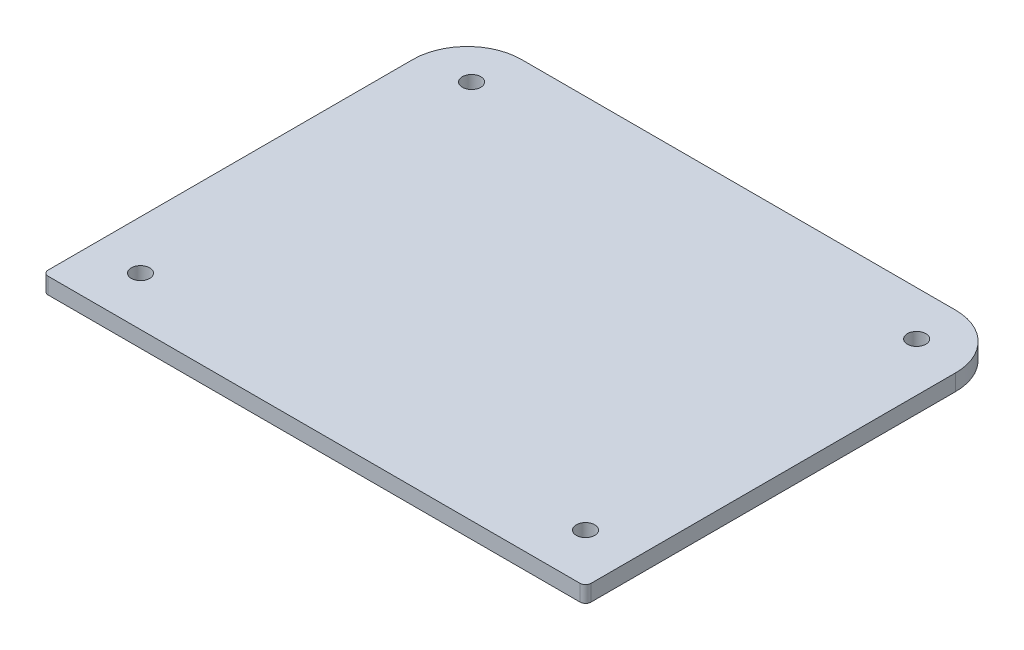
ISO-10303-21;
HEADER;
FILE_DESCRIPTION(('STEP AP214'),'2;1');
FILE_NAME('part.step','',(''),(''),'','','');
FILE_SCHEMA(('AUTOMOTIVE_DESIGN { 1 0 10303 214 1 1 1 1 }'));
ENDSEC;
DATA;
#1=APPLICATION_CONTEXT('core data for automotive mechanical design processes');
#2=APPLICATION_PROTOCOL_DEFINITION('international standard','automotive_design',2000,#1);
#3=PRODUCT_CONTEXT('',#1,'mechanical');
#4=PRODUCT('Part','Part','',(#3));
#5=PRODUCT_RELATED_PRODUCT_CATEGORY('part','',(#4));
#6=PRODUCT_DEFINITION_FORMATION('','',#4);
#7=PRODUCT_DEFINITION_CONTEXT('part definition',#1,'design');
#8=PRODUCT_DEFINITION('design','',#6,#7);
#9=PRODUCT_DEFINITION_SHAPE('','',#8);
#10=(LENGTH_UNIT() NAMED_UNIT(*) SI_UNIT(.MILLI.,.METRE.));
#11=(NAMED_UNIT(*) PLANE_ANGLE_UNIT() SI_UNIT($,.RADIAN.));
#12=(NAMED_UNIT(*) SI_UNIT($,.STERADIAN.) SOLID_ANGLE_UNIT());
#13=UNCERTAINTY_MEASURE_WITH_UNIT(LENGTH_MEASURE(1.E-05),#10,'distance_accuracy_value','');
#14=(GEOMETRIC_REPRESENTATION_CONTEXT(3) GLOBAL_UNCERTAINTY_ASSIGNED_CONTEXT((#13)) GLOBAL_UNIT_ASSIGNED_CONTEXT((#10,
#11,#12)) REPRESENTATION_CONTEXT('',''));
#15=CARTESIAN_POINT('',(0.,0.,0.));
#16=DIRECTION('',(0.,0.,1.));
#17=DIRECTION('',(1.,0.,0.));
#18=AXIS2_PLACEMENT_3D('',#15,#16,#17);
#19=CARTESIAN_POINT('',(-50.,36.,-50.));
#20=DIRECTION('',(1.,0.,0.));
#21=DIRECTION('',(0.,0.,-1.));
#22=AXIS2_PLACEMENT_3D('',#19,#20,#21);
#23=PLANE('',#22);
#24=DIRECTION('',(0.,0.,1.));
#25=VECTOR('',#24,1.);
#26=CARTESIAN_POINT('',(-50.,33.,-50.));
#27=LINE('',#26,#25);
#28=CARTESIAN_POINT('',(-50.,33.,-18.1910757686583));
#29=VERTEX_POINT('',#28);
#30=CARTESIAN_POINT('',(-50.,33.,49.));
#31=VERTEX_POINT('',#30);
#32=EDGE_CURVE('E120',#29,#31,#27,.T.);
#33=ORIENTED_EDGE('',*,*,#32,.T.);
#34=DIRECTION('',(0.,-1.,0.));
#35=VECTOR('',#34,1.);
#36=CARTESIAN_POINT('',(-50.,36.,49.));
#37=LINE('',#36,#35);
#38=CARTESIAN_POINT('',(-50.,36.,49.));
#39=VERTEX_POINT('',#38);
#40=EDGE_CURVE('E70',#31,#39,#37,.F.);
#41=ORIENTED_EDGE('',*,*,#40,.T.);
#42=DIRECTION('',(0.,0.,1.));
#43=VECTOR('',#42,1.);
#44=CARTESIAN_POINT('',(-50.,36.,-50.));
#45=LINE('',#44,#43);
#46=CARTESIAN_POINT('',(-50.,36.,-18.1910757686583));
#47=VERTEX_POINT('',#46);
#48=EDGE_CURVE('E150',#47,#39,#45,.T.);
#49=ORIENTED_EDGE('',*,*,#48,.F.);
#50=DIRECTION('',(0.,1.,0.));
#51=VECTOR('',#50,1.);
#52=CARTESIAN_POINT('',(-50.,36.,-18.1910757686583));
#53=LINE('',#52,#51);
#54=EDGE_CURVE('E134',#47,#29,#53,.F.);
#55=ORIENTED_EDGE('',*,*,#54,.T.);
#56=EDGE_LOOP('',(#33,#41,#49,#55));
#57=FACE_BOUND('',#56,.T.);
#58=ADVANCED_FACE('F43',(#57),#23,.F.);
#59=CARTESIAN_POINT('',(0.,33.,0.));
#60=DIRECTION('',(0.,1.,0.));
#61=DIRECTION('',(0.,0.,1.));
#62=AXIS2_PLACEMENT_3D('',#59,#60,#61);
#63=PLANE('',#62);
#64=CARTESIAN_POINT('',(-41.,33.,-20.));
#65=DIRECTION('',(0.,1.,0.));
#66=DIRECTION('',(0.,0.,1.));
#67=AXIS2_PLACEMENT_3D('',#64,#65,#66);
#68=CIRCLE('',#67,1.7);
#69=CARTESIAN_POINT('',(-41.,33.,-18.3));
#70=VERTEX_POINT('',#69);
#71=EDGE_CURVE('E123',#70,#70,#68,.F.);
#72=ORIENTED_EDGE('',*,*,#71,.F.);
#73=EDGE_LOOP('',(#72));
#74=FACE_BOUND('',#73,.T.);
#75=CARTESIAN_POINT('',(41.,33.,-20.));
#76=DIRECTION('',(0.,1.,0.));
#77=DIRECTION('',(0.,0.,1.));
#78=AXIS2_PLACEMENT_3D('',#75,#76,#77);
#79=CIRCLE('',#78,1.7);
#80=CARTESIAN_POINT('',(41.,33.,-18.3));
#81=VERTEX_POINT('',#80);
#82=EDGE_CURVE('E229',#81,#81,#79,.F.);
#83=ORIENTED_EDGE('',*,*,#82,.F.);
#84=EDGE_LOOP('',(#83));
#85=FACE_BOUND('',#84,.T.);
#86=CARTESIAN_POINT('',(41.,33.,41.));
#87=DIRECTION('',(0.,1.,0.));
#88=DIRECTION('',(0.,0.,1.));
#89=AXIS2_PLACEMENT_3D('',#86,#87,#88);
#90=CIRCLE('',#89,1.7);
#91=CARTESIAN_POINT('',(41.,33.,42.7));
#92=VERTEX_POINT('',#91);
#93=EDGE_CURVE('E218',#92,#92,#90,.F.);
#94=ORIENTED_EDGE('',*,*,#93,.F.);
#95=EDGE_LOOP('',(#94));
#96=FACE_BOUND('',#95,.T.);
#97=CARTESIAN_POINT('',(-41.,33.,41.));
#98=DIRECTION('',(0.,1.,0.));
#99=DIRECTION('',(0.,0.,1.));
#100=AXIS2_PLACEMENT_3D('',#97,#98,#99);
#101=CIRCLE('',#100,1.7);
#102=CARTESIAN_POINT('',(-41.,33.,42.7));
#103=VERTEX_POINT('',#102);
#104=EDGE_CURVE('E219',#103,#103,#101,.F.);
#105=ORIENTED_EDGE('',*,*,#104,.F.);
#106=EDGE_LOOP('',(#105));
#107=FACE_BOUND('',#106,.T.);
#108=DIRECTION('',(1.,0.,0.));
#109=VECTOR('',#108,1.);
#110=CARTESIAN_POINT('',(-50.,33.,50.));
#111=LINE('',#110,#109);
#112=CARTESIAN_POINT('',(-49.,33.,50.));
#113=VERTEX_POINT('',#112);
#114=CARTESIAN_POINT('',(49.,33.,50.));
#115=VERTEX_POINT('',#114);
#116=EDGE_CURVE('E147',#113,#115,#111,.T.);
#117=ORIENTED_EDGE('',*,*,#116,.F.);
#118=CARTESIAN_POINT('',(-49.,33.,49.));
#119=DIRECTION('',(0.,1.,0.));
#120=DIRECTION('',(0.,0.,1.));
#121=AXIS2_PLACEMENT_3D('',#118,#119,#120);
#122=CIRCLE('',#121,1.);
#123=EDGE_CURVE('E178',#113,#31,#122,.F.);
#124=ORIENTED_EDGE('',*,*,#123,.T.);
#125=ORIENTED_EDGE('',*,*,#32,.F.);
#126=CARTESIAN_POINT('',(-40.,33.,-18.1910757686583));
#127=DIRECTION('',(0.,1.,0.));
#128=DIRECTION('',(0.,0.,1.));
#129=AXIS2_PLACEMENT_3D('',#126,#127,#128);
#130=CIRCLE('',#129,10.);
#131=CARTESIAN_POINT('',(-40.,33.,-28.1910757686583));
#132=VERTEX_POINT('',#131);
#133=EDGE_CURVE('E133',#29,#132,#130,.F.);
#134=ORIENTED_EDGE('',*,*,#133,.T.);
#135=DIRECTION('',(-1.,0.,0.));
#136=VECTOR('',#135,1.);
#137=CARTESIAN_POINT('',(-50.,33.,-28.1910757686583));
#138=LINE('',#137,#136);
#139=CARTESIAN_POINT('',(40.,33.,-28.1910757686583));
#140=VERTEX_POINT('',#139);
#141=EDGE_CURVE('E129',#140,#132,#138,.T.);
#142=ORIENTED_EDGE('',*,*,#141,.F.);
#143=CARTESIAN_POINT('',(40.,33.,-18.1910757686583));
#144=DIRECTION('',(0.,1.,0.));
#145=DIRECTION('',(0.,0.,1.));
#146=AXIS2_PLACEMENT_3D('',#143,#144,#145);
#147=CIRCLE('',#146,10.);
#148=CARTESIAN_POINT('',(50.,33.,-18.1910757686583));
#149=VERTEX_POINT('',#148);
#150=EDGE_CURVE('E124',#140,#149,#147,.F.);
#151=ORIENTED_EDGE('',*,*,#150,.T.);
#152=DIRECTION('',(0.,0.,-1.));
#153=VECTOR('',#152,1.);
#154=CARTESIAN_POINT('',(50.,33.,-50.));
#155=LINE('',#154,#153);
#156=CARTESIAN_POINT('',(50.,33.,49.));
#157=VERTEX_POINT('',#156);
#158=EDGE_CURVE('E115',#157,#149,#155,.T.);
#159=ORIENTED_EDGE('',*,*,#158,.F.);
#160=CARTESIAN_POINT('',(49.,33.,49.));
#161=DIRECTION('',(0.,1.,0.));
#162=DIRECTION('',(0.,0.,1.));
#163=AXIS2_PLACEMENT_3D('',#160,#161,#162);
#164=CIRCLE('',#163,1.);
#165=EDGE_CURVE('E174',#157,#115,#164,.F.);
#166=ORIENTED_EDGE('',*,*,#165,.T.);
#167=EDGE_LOOP('',(#117,#124,#125,#134,#142,#151,#159,#166));
#168=FACE_BOUND('',#167,.T.);
#169=ADVANCED_FACE('F130',(#74,#85,#96,#107,#168),#63,.F.);
#170=CARTESIAN_POINT('',(50.,36.,-50.));
#171=DIRECTION('',(-1.,0.,0.));
#172=DIRECTION('',(0.,0.,1.));
#173=AXIS2_PLACEMENT_3D('',#170,#171,#172);
#174=PLANE('',#173);
#175=DIRECTION('',(0.,0.,-1.));
#176=VECTOR('',#175,1.);
#177=CARTESIAN_POINT('',(50.,36.,-50.));
#178=LINE('',#177,#176);
#179=CARTESIAN_POINT('',(50.,36.,49.));
#180=VERTEX_POINT('',#179);
#181=CARTESIAN_POINT('',(50.,36.,-18.1910757686583));
#182=VERTEX_POINT('',#181);
#183=EDGE_CURVE('E203',#180,#182,#178,.T.);
#184=ORIENTED_EDGE('',*,*,#183,.F.);
#185=DIRECTION('',(0.,-1.,0.));
#186=VECTOR('',#185,1.);
#187=CARTESIAN_POINT('',(50.,36.,49.));
#188=LINE('',#187,#186);
#189=EDGE_CURVE('E11',#180,#157,#188,.T.);
#190=ORIENTED_EDGE('',*,*,#189,.T.);
#191=ORIENTED_EDGE('',*,*,#158,.T.);
#192=DIRECTION('',(0.,1.,0.));
#193=VECTOR('',#192,1.);
#194=CARTESIAN_POINT('',(50.,36.,-18.1910757686583));
#195=LINE('',#194,#193);
#196=EDGE_CURVE('E116',#149,#182,#195,.T.);
#197=ORIENTED_EDGE('',*,*,#196,.T.);
#198=EDGE_LOOP('',(#184,#190,#191,#197));
#199=FACE_BOUND('',#198,.T.);
#200=ADVANCED_FACE('F111',(#199),#174,.F.);
#201=CARTESIAN_POINT('',(-50.,36.,50.));
#202=DIRECTION('',(0.,0.,-1.));
#203=DIRECTION('',(-1.,0.,0.));
#204=AXIS2_PLACEMENT_3D('',#201,#202,#203);
#205=PLANE('',#204);
#206=DIRECTION('',(1.,0.,0.));
#207=VECTOR('',#206,1.);
#208=CARTESIAN_POINT('',(-50.,36.,50.));
#209=LINE('',#208,#207);
#210=CARTESIAN_POINT('',(-49.,36.,50.));
#211=VERTEX_POINT('',#210);
#212=CARTESIAN_POINT('',(49.,36.,50.));
#213=VERTEX_POINT('',#212);
#214=EDGE_CURVE('E143',#211,#213,#209,.T.);
#215=ORIENTED_EDGE('',*,*,#214,.F.);
#216=DIRECTION('',(0.,-1.,0.));
#217=VECTOR('',#216,1.);
#218=CARTESIAN_POINT('',(-49.,36.,50.));
#219=LINE('',#218,#217);
#220=EDGE_CURVE('E166',#211,#113,#219,.T.);
#221=ORIENTED_EDGE('',*,*,#220,.T.);
#222=ORIENTED_EDGE('',*,*,#116,.T.);
#223=DIRECTION('',(0.,-1.,0.));
#224=VECTOR('',#223,1.);
#225=CARTESIAN_POINT('',(49.,36.,50.));
#226=LINE('',#225,#224);
#227=EDGE_CURVE('E167',#115,#213,#226,.F.);
#228=ORIENTED_EDGE('',*,*,#227,.T.);
#229=EDGE_LOOP('',(#215,#221,#222,#228));
#230=FACE_BOUND('',#229,.T.);
#231=ADVANCED_FACE('F193',(#230),#205,.F.);
#232=CARTESIAN_POINT('',(0.,36.,0.));
#233=DIRECTION('',(0.,1.,0.));
#234=DIRECTION('',(0.,0.,1.));
#235=AXIS2_PLACEMENT_3D('',#232,#233,#234);
#236=PLANE('',#235);
#237=ORIENTED_EDGE('',*,*,#48,.T.);
#238=CARTESIAN_POINT('',(-49.,36.,49.));
#239=DIRECTION('',(0.,1.,0.));
#240=DIRECTION('',(0.,0.,1.));
#241=AXIS2_PLACEMENT_3D('',#238,#239,#240);
#242=CIRCLE('',#241,1.);
#243=EDGE_CURVE('E55',#39,#211,#242,.T.);
#244=ORIENTED_EDGE('',*,*,#243,.T.);
#245=ORIENTED_EDGE('',*,*,#214,.T.);
#246=CARTESIAN_POINT('',(49.,36.,49.));
#247=DIRECTION('',(0.,1.,0.));
#248=DIRECTION('',(0.,0.,1.));
#249=AXIS2_PLACEMENT_3D('',#246,#247,#248);
#250=CIRCLE('',#249,1.);
#251=EDGE_CURVE('E56',#213,#180,#250,.T.);
#252=ORIENTED_EDGE('',*,*,#251,.T.);
#253=ORIENTED_EDGE('',*,*,#183,.T.);
#254=CARTESIAN_POINT('',(40.,36.,-18.1910757686583));
#255=DIRECTION('',(0.,1.,0.));
#256=DIRECTION('',(0.,0.,1.));
#257=AXIS2_PLACEMENT_3D('',#254,#255,#256);
#258=CIRCLE('',#257,10.);
#259=CARTESIAN_POINT('',(40.,36.,-28.1910757686583));
#260=VERTEX_POINT('',#259);
#261=EDGE_CURVE('E136',#182,#260,#258,.T.);
#262=ORIENTED_EDGE('',*,*,#261,.T.);
#263=DIRECTION('',(1.,0.,0.));
#264=VECTOR('',#263,1.);
#265=CARTESIAN_POINT('',(-50.,36.,-28.1910757686583));
#266=LINE('',#265,#264);
#267=CARTESIAN_POINT('',(-40.,36.,-28.1910757686583));
#268=VERTEX_POINT('',#267);
#269=EDGE_CURVE('E238',#268,#260,#266,.T.);
#270=ORIENTED_EDGE('',*,*,#269,.F.);
#271=CARTESIAN_POINT('',(-40.,36.,-18.1910757686583));
#272=DIRECTION('',(0.,1.,0.));
#273=DIRECTION('',(0.,0.,1.));
#274=AXIS2_PLACEMENT_3D('',#271,#272,#273);
#275=CIRCLE('',#274,10.);
#276=EDGE_CURVE('E139',#268,#47,#275,.T.);
#277=ORIENTED_EDGE('',*,*,#276,.T.);
#278=EDGE_LOOP('',(#237,#244,#245,#252,#253,#262,#270,#277));
#279=FACE_BOUND('',#278,.T.);
#280=CARTESIAN_POINT('',(-41.,36.,41.));
#281=DIRECTION('',(0.,1.,0.));
#282=DIRECTION('',(0.,0.,1.));
#283=AXIS2_PLACEMENT_3D('',#280,#281,#282);
#284=CIRCLE('',#283,1.7);
#285=CARTESIAN_POINT('',(-41.,36.,42.7));
#286=VERTEX_POINT('',#285);
#287=EDGE_CURVE('E214',#286,#286,#284,.T.);
#288=ORIENTED_EDGE('',*,*,#287,.F.);
#289=EDGE_LOOP('',(#288));
#290=FACE_BOUND('',#289,.T.);
#291=CARTESIAN_POINT('',(41.,36.,41.));
#292=DIRECTION('',(0.,1.,0.));
#293=DIRECTION('',(0.,0.,1.));
#294=AXIS2_PLACEMENT_3D('',#291,#292,#293);
#295=CIRCLE('',#294,1.7);
#296=CARTESIAN_POINT('',(41.,36.,42.7));
#297=VERTEX_POINT('',#296);
#298=EDGE_CURVE('E221',#297,#297,#295,.T.);
#299=ORIENTED_EDGE('',*,*,#298,.F.);
#300=EDGE_LOOP('',(#299));
#301=FACE_BOUND('',#300,.T.);
#302=CARTESIAN_POINT('',(41.,36.,-20.));
#303=DIRECTION('',(0.,1.,0.));
#304=DIRECTION('',(0.,0.,1.));
#305=AXIS2_PLACEMENT_3D('',#302,#303,#304);
#306=CIRCLE('',#305,1.7);
#307=CARTESIAN_POINT('',(41.,36.,-18.3));
#308=VERTEX_POINT('',#307);
#309=EDGE_CURVE('E212',#308,#308,#306,.T.);
#310=ORIENTED_EDGE('',*,*,#309,.F.);
#311=EDGE_LOOP('',(#310));
#312=FACE_BOUND('',#311,.T.);
#313=CARTESIAN_POINT('',(-41.,36.,-20.));
#314=DIRECTION('',(0.,1.,0.));
#315=DIRECTION('',(0.,0.,1.));
#316=AXIS2_PLACEMENT_3D('',#313,#314,#315);
#317=CIRCLE('',#316,1.7);
#318=CARTESIAN_POINT('',(-41.,36.,-18.3));
#319=VERTEX_POINT('',#318);
#320=EDGE_CURVE('E209',#319,#319,#317,.T.);
#321=ORIENTED_EDGE('',*,*,#320,.F.);
#322=EDGE_LOOP('',(#321));
#323=FACE_BOUND('',#322,.T.);
#324=ADVANCED_FACE('F186',(#279,#290,#301,#312,#323),#236,.T.);
#325=CARTESIAN_POINT('',(-41.,28.1916738879315,-20.));
#326=DIRECTION('',(0.,1.,0.));
#327=DIRECTION('',(0.,0.,1.));
#328=AXIS2_PLACEMENT_3D('',#325,#326,#327);
#329=CYLINDRICAL_SURFACE('',#328,1.7);
#330=ORIENTED_EDGE('',*,*,#71,.T.);
#331=EDGE_LOOP('',(#330));
#332=FACE_BOUND('',#331,.T.);
#333=ORIENTED_EDGE('',*,*,#320,.T.);
#334=EDGE_LOOP('',(#333));
#335=FACE_BOUND('',#334,.T.);
#336=ADVANCED_FACE('F315',(#332,#335),#329,.F.);
#337=CARTESIAN_POINT('',(41.,28.1916738879315,-20.));
#338=DIRECTION('',(0.,1.,0.));
#339=DIRECTION('',(0.,0.,1.));
#340=AXIS2_PLACEMENT_3D('',#337,#338,#339);
#341=CYLINDRICAL_SURFACE('',#340,1.7);
#342=ORIENTED_EDGE('',*,*,#82,.T.);
#343=EDGE_LOOP('',(#342));
#344=FACE_BOUND('',#343,.T.);
#345=ORIENTED_EDGE('',*,*,#309,.T.);
#346=EDGE_LOOP('',(#345));
#347=FACE_BOUND('',#346,.T.);
#348=ADVANCED_FACE('F301',(#344,#347),#341,.F.);
#349=CARTESIAN_POINT('',(41.,28.1916738879315,41.));
#350=DIRECTION('',(0.,1.,0.));
#351=DIRECTION('',(0.,0.,1.));
#352=AXIS2_PLACEMENT_3D('',#349,#350,#351);
#353=CYLINDRICAL_SURFACE('',#352,1.7);
#354=ORIENTED_EDGE('',*,*,#93,.T.);
#355=EDGE_LOOP('',(#354));
#356=FACE_BOUND('',#355,.T.);
#357=ORIENTED_EDGE('',*,*,#298,.T.);
#358=EDGE_LOOP('',(#357));
#359=FACE_BOUND('',#358,.T.);
#360=ADVANCED_FACE('F291',(#356,#359),#353,.F.);
#361=CARTESIAN_POINT('',(-41.,28.1916738879315,41.));
#362=DIRECTION('',(0.,1.,0.));
#363=DIRECTION('',(0.,0.,1.));
#364=AXIS2_PLACEMENT_3D('',#361,#362,#363);
#365=CYLINDRICAL_SURFACE('',#364,1.7);
#366=ORIENTED_EDGE('',*,*,#104,.T.);
#367=EDGE_LOOP('',(#366));
#368=FACE_BOUND('',#367,.T.);
#369=ORIENTED_EDGE('',*,*,#287,.T.);
#370=EDGE_LOOP('',(#369));
#371=FACE_BOUND('',#370,.T.);
#372=ADVANCED_FACE('F283',(#368,#371),#365,.F.);
#373=CARTESIAN_POINT('',(-50.,-69.3505211326665,-28.1910757686583));
#374=DIRECTION('',(0.,0.,1.));
#375=DIRECTION('',(1.,0.,0.));
#376=AXIS2_PLACEMENT_3D('',#373,#374,#375);
#377=PLANE('',#376);
#378=ORIENTED_EDGE('',*,*,#269,.T.);
#379=DIRECTION('',(0.,1.,0.));
#380=VECTOR('',#379,1.);
#381=CARTESIAN_POINT('',(40.,-69.3505211326665,-28.1910757686583));
#382=LINE('',#381,#380);
#383=EDGE_CURVE('E157',#260,#140,#382,.F.);
#384=ORIENTED_EDGE('',*,*,#383,.T.);
#385=ORIENTED_EDGE('',*,*,#141,.T.);
#386=DIRECTION('',(0.,1.,0.));
#387=VECTOR('',#386,1.);
#388=CARTESIAN_POINT('',(-40.,-69.3505211326665,-28.1910757686583));
#389=LINE('',#388,#387);
#390=EDGE_CURVE('E154',#132,#268,#389,.T.);
#391=ORIENTED_EDGE('',*,*,#390,.T.);
#392=EDGE_LOOP('',(#378,#384,#385,#391));
#393=FACE_BOUND('',#392,.T.);
#394=ADVANCED_FACE('F248',(#393),#377,.F.);
#395=CARTESIAN_POINT('',(40.,36.,-18.1910757686583));
#396=DIRECTION('',(0.,1.,0.));
#397=DIRECTION('',(0.,0.,1.));
#398=AXIS2_PLACEMENT_3D('',#395,#396,#397);
#399=CYLINDRICAL_SURFACE('',#398,10.);
#400=ORIENTED_EDGE('',*,*,#150,.F.);
#401=ORIENTED_EDGE('',*,*,#383,.F.);
#402=ORIENTED_EDGE('',*,*,#261,.F.);
#403=ORIENTED_EDGE('',*,*,#196,.F.);
#404=EDGE_LOOP('',(#400,#401,#402,#403));
#405=FACE_BOUND('',#404,.T.);
#406=ADVANCED_FACE('F140',(#405),#399,.T.);
#407=CARTESIAN_POINT('',(-40.,-69.3505211326665,-18.1910757686583));
#408=DIRECTION('',(0.,1.,0.));
#409=DIRECTION('',(0.,0.,1.));
#410=AXIS2_PLACEMENT_3D('',#407,#408,#409);
#411=CYLINDRICAL_SURFACE('',#410,10.);
#412=ORIENTED_EDGE('',*,*,#133,.F.);
#413=ORIENTED_EDGE('',*,*,#54,.F.);
#414=ORIENTED_EDGE('',*,*,#276,.F.);
#415=ORIENTED_EDGE('',*,*,#390,.F.);
#416=EDGE_LOOP('',(#412,#413,#414,#415));
#417=FACE_BOUND('',#416,.T.);
#418=ADVANCED_FACE('F251',(#417),#411,.T.);
#419=CARTESIAN_POINT('',(-49.,36.,49.));
#420=DIRECTION('',(0.,-1.,0.));
#421=DIRECTION('',(0.,0.,-1.));
#422=AXIS2_PLACEMENT_3D('',#419,#420,#421);
#423=CYLINDRICAL_SURFACE('',#422,1.);
#424=ORIENTED_EDGE('',*,*,#243,.F.);
#425=ORIENTED_EDGE('',*,*,#40,.F.);
#426=ORIENTED_EDGE('',*,*,#123,.F.);
#427=ORIENTED_EDGE('',*,*,#220,.F.);
#428=EDGE_LOOP('',(#424,#425,#426,#427));
#429=FACE_BOUND('',#428,.T.);
#430=ADVANCED_FACE('F192',(#429),#423,.T.);
#431=CARTESIAN_POINT('',(49.,36.,49.));
#432=DIRECTION('',(0.,-1.,0.));
#433=DIRECTION('',(0.,0.,-1.));
#434=AXIS2_PLACEMENT_3D('',#431,#432,#433);
#435=CYLINDRICAL_SURFACE('',#434,1.);
#436=ORIENTED_EDGE('',*,*,#251,.F.);
#437=ORIENTED_EDGE('',*,*,#227,.F.);
#438=ORIENTED_EDGE('',*,*,#165,.F.);
#439=ORIENTED_EDGE('',*,*,#189,.F.);
#440=EDGE_LOOP('',(#436,#437,#438,#439));
#441=FACE_BOUND('',#440,.T.);
#442=ADVANCED_FACE('F44',(#441),#435,.T.);
#443=CLOSED_SHELL('',(#58,#169,#200,#231,#324,#336,#348,#360,#372,#394,#406,#418,#430,#442));
#444=MANIFOLD_SOLID_BREP('B2',#443);
#445=ADVANCED_BREP_SHAPE_REPRESENTATION('',(#18,#444),#14);
#446=SHAPE_DEFINITION_REPRESENTATION(#9,#445);
ENDSEC;
END-ISO-10303-21;
